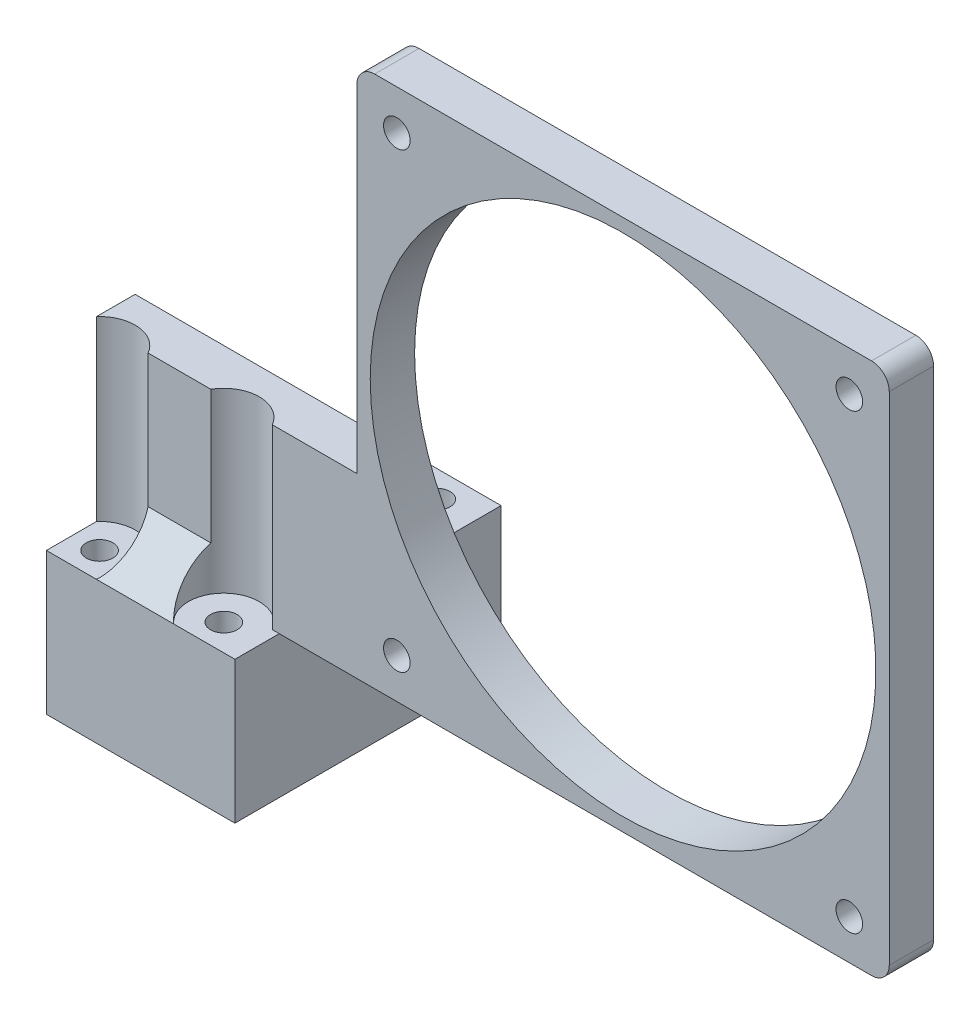
ISO-10303-21;
HEADER;
FILE_DESCRIPTION(('STEP AP214'),'2;1');
FILE_NAME('part.step','',(''),(''),'','','');
FILE_SCHEMA(('AUTOMOTIVE_DESIGN { 1 0 10303 214 1 1 1 1 }'));
ENDSEC;
DATA;
#1=APPLICATION_CONTEXT('core data for automotive mechanical design processes');
#2=APPLICATION_PROTOCOL_DEFINITION('international standard','automotive_design',2000,#1);
#3=PRODUCT_CONTEXT('',#1,'mechanical');
#4=PRODUCT('Part','Part','',(#3));
#5=PRODUCT_RELATED_PRODUCT_CATEGORY('part','',(#4));
#6=PRODUCT_DEFINITION_FORMATION('','',#4);
#7=PRODUCT_DEFINITION_CONTEXT('part definition',#1,'design');
#8=PRODUCT_DEFINITION('design','',#6,#7);
#9=PRODUCT_DEFINITION_SHAPE('','',#8);
#10=(LENGTH_UNIT() NAMED_UNIT(*) SI_UNIT(.MILLI.,.METRE.));
#11=(NAMED_UNIT(*) PLANE_ANGLE_UNIT() SI_UNIT($,.RADIAN.));
#12=(NAMED_UNIT(*) SI_UNIT($,.STERADIAN.) SOLID_ANGLE_UNIT());
#13=UNCERTAINTY_MEASURE_WITH_UNIT(LENGTH_MEASURE(1.E-05),#10,'distance_accuracy_value','');
#14=(GEOMETRIC_REPRESENTATION_CONTEXT(3) GLOBAL_UNCERTAINTY_ASSIGNED_CONTEXT((#13)) GLOBAL_UNIT_ASSIGNED_CONTEXT((#10,
#11,#12)) REPRESENTATION_CONTEXT('',''));
#15=CARTESIAN_POINT('',(0.,0.,0.));
#16=DIRECTION('',(0.,0.,1.));
#17=DIRECTION('',(1.,0.,0.));
#18=AXIS2_PLACEMENT_3D('',#15,#16,#17);
#19=CARTESIAN_POINT('',(0.,0.,0.));
#20=DIRECTION('',(0.,-1.,0.));
#21=DIRECTION('',(0.,0.,-1.));
#22=AXIS2_PLACEMENT_3D('',#19,#20,#21);
#23=PLANE('',#22);
#24=CARTESIAN_POINT('',(-73.,0.,7.));
#25=DIRECTION('',(0.,-1.,0.));
#26=DIRECTION('',(0.,0.,-1.));
#27=AXIS2_PLACEMENT_3D('',#24,#25,#26);
#28=CIRCLE('',#27,1.5);
#29=CARTESIAN_POINT('',(-73.,0.,5.5));
#30=VERTEX_POINT('',#29);
#31=EDGE_CURVE('E223',#30,#30,#28,.T.);
#32=ORIENTED_EDGE('',*,*,#31,.T.);
#33=EDGE_LOOP('',(#32));
#34=FACE_BOUND('',#33,.T.);
#35=CARTESIAN_POINT('',(-73.,0.,7.));
#36=DIRECTION('',(0.,1.,0.));
#37=DIRECTION('',(0.,0.,1.));
#38=AXIS2_PLACEMENT_3D('',#35,#36,#37);
#39=CIRCLE('',#38,4.00000000000001);
#40=CARTESIAN_POINT('',(-69.5358983848622,0.,5.));
#41=VERTEX_POINT('',#40);
#42=CARTESIAN_POINT('',(-75.6457513110646,0.,10.));
#43=VERTEX_POINT('',#42);
#44=EDGE_CURVE('E171',#41,#43,#39,.T.);
#45=ORIENTED_EDGE('',*,*,#44,.T.);
#46=DIRECTION('',(-1.,0.,0.));
#47=VECTOR('',#46,1.);
#48=CARTESIAN_POINT('',(-90.,0.,10.));
#49=LINE('',#48,#47);
#50=CARTESIAN_POINT('',(-68.75,0.,10.));
#51=VERTEX_POINT('',#50);
#52=EDGE_CURVE('E340',#51,#43,#49,.T.);
#53=ORIENTED_EDGE('',*,*,#52,.F.);
#54=DIRECTION('',(0.,0.,1.));
#55=VECTOR('',#54,1.);
#56=CARTESIAN_POINT('',(-68.75,0.,10.));
#57=LINE('',#56,#55);
#58=CARTESIAN_POINT('',(-68.75,0.,5.));
#59=VERTEX_POINT('',#58);
#60=EDGE_CURVE('E196',#59,#51,#57,.T.);
#61=ORIENTED_EDGE('',*,*,#60,.F.);
#62=DIRECTION('',(1.,0.,0.));
#63=VECTOR('',#62,1.);
#64=CARTESIAN_POINT('',(0.,0.,5.));
#65=LINE('',#64,#63);
#66=EDGE_CURVE('E188',#41,#59,#65,.T.);
#67=ORIENTED_EDGE('',*,*,#66,.F.);
#68=EDGE_LOOP('',(#45,#53,#61,#67));
#69=FACE_BOUND('',#68,.T.);
#70=ADVANCED_FACE('F38',(#34,#69),#23,.F.);
#71=CARTESIAN_POINT('',(0.,0.,5.));
#72=DIRECTION('',(0.,0.,1.));
#73=DIRECTION('',(1.,0.,0.));
#74=AXIS2_PLACEMENT_3D('',#71,#72,#73);
#75=PLANE('',#74);
#76=DIRECTION('',(0.,-1.,0.));
#77=VECTOR('',#76,1.);
#78=CARTESIAN_POINT('',(-83.5358983848622,30.,5.));
#79=LINE('',#78,#77);
#80=CARTESIAN_POINT('',(-83.5358983848622,20.,5.));
#81=VERTEX_POINT('',#80);
#82=CARTESIAN_POINT('',(-83.5358983848622,5.00000000000003,5.));
#83=VERTEX_POINT('',#82);
#84=EDGE_CURVE('E374',#81,#83,#79,.T.);
#85=ORIENTED_EDGE('',*,*,#84,.T.);
#86=DIRECTION('',(1.,0.,0.));
#87=VECTOR('',#86,1.);
#88=CARTESIAN_POINT('',(0.,5.00000000000003,5.));
#89=LINE('',#88,#87);
#90=CARTESIAN_POINT('',(-76.4641016151377,5.00000000000003,5.));
#91=VERTEX_POINT('',#90);
#92=EDGE_CURVE('E239',#83,#91,#89,.T.);
#93=ORIENTED_EDGE('',*,*,#92,.T.);
#94=DIRECTION('',(0.,-1.,0.));
#95=VECTOR('',#94,1.);
#96=CARTESIAN_POINT('',(-76.4641016151377,30.,5.));
#97=LINE('',#96,#95);
#98=CARTESIAN_POINT('',(-76.4641016151377,20.,5.));
#99=VERTEX_POINT('',#98);
#100=EDGE_CURVE('E192',#91,#99,#97,.F.);
#101=ORIENTED_EDGE('',*,*,#100,.T.);
#102=DIRECTION('',(1.,0.,0.));
#103=VECTOR('',#102,1.);
#104=CARTESIAN_POINT('',(-90.,20.,5.));
#105=LINE('',#104,#103);
#106=EDGE_CURVE('E315',#81,#99,#105,.T.);
#107=ORIENTED_EDGE('',*,*,#106,.F.);
#108=EDGE_LOOP('',(#85,#93,#101,#107));
#109=FACE_BOUND('',#108,.T.);
#110=ADVANCED_FACE('F435',(#109),#75,.T.);
#111=CARTESIAN_POINT('',(-30.,30.,5.));
#112=DIRECTION('',(0.,0.,-1.));
#113=DIRECTION('',(-1.,0.,0.));
#114=AXIS2_PLACEMENT_3D('',#111,#112,#113);
#115=CIRCLE('',#114,28.5);
#116=CARTESIAN_POINT('',(-58.5,30.,5.));
#117=VERTEX_POINT('',#116);
#118=EDGE_CURVE('E309',#117,#117,#115,.T.);
#119=ORIENTED_EDGE('',*,*,#118,.T.);
#120=EDGE_LOOP('',(#119));
#121=FACE_BOUND('',#120,.T.);
#122=CARTESIAN_POINT('',(-55.5,55.5,5.));
#123=DIRECTION('',(0.,0.,-1.));
#124=DIRECTION('',(-1.,0.,0.));
#125=AXIS2_PLACEMENT_3D('',#122,#123,#124);
#126=CIRCLE('',#125,1.5);
#127=CARTESIAN_POINT('',(-57.,55.5,5.));
#128=VERTEX_POINT('',#127);
#129=EDGE_CURVE('E291',#128,#128,#126,.T.);
#130=ORIENTED_EDGE('',*,*,#129,.T.);
#131=EDGE_LOOP('',(#130));
#132=FACE_BOUND('',#131,.T.);
#133=CARTESIAN_POINT('',(-4.5,4.50000000000002,5.));
#134=DIRECTION('',(0.,0.,-1.));
#135=DIRECTION('',(-1.,0.,0.));
#136=AXIS2_PLACEMENT_3D('',#133,#134,#135);
#137=CIRCLE('',#136,1.5);
#138=CARTESIAN_POINT('',(-6.,4.50000000000002,5.));
#139=VERTEX_POINT('',#138);
#140=EDGE_CURVE('E297',#139,#139,#137,.T.);
#141=ORIENTED_EDGE('',*,*,#140,.T.);
#142=EDGE_LOOP('',(#141));
#143=FACE_BOUND('',#142,.T.);
#144=CARTESIAN_POINT('',(-55.5,4.50000000000002,5.));
#145=DIRECTION('',(0.,0.,-1.));
#146=DIRECTION('',(-1.,0.,0.));
#147=AXIS2_PLACEMENT_3D('',#144,#145,#146);
#148=CIRCLE('',#147,1.5);
#149=CARTESIAN_POINT('',(-57.,4.50000000000002,5.));
#150=VERTEX_POINT('',#149);
#151=EDGE_CURVE('E298',#150,#150,#148,.T.);
#152=ORIENTED_EDGE('',*,*,#151,.T.);
#153=EDGE_LOOP('',(#152));
#154=FACE_BOUND('',#153,.T.);
#155=CARTESIAN_POINT('',(-4.5,55.5,5.));
#156=DIRECTION('',(0.,0.,-1.));
#157=DIRECTION('',(-1.,0.,0.));
#158=AXIS2_PLACEMENT_3D('',#155,#156,#157);
#159=CIRCLE('',#158,1.5);
#160=CARTESIAN_POINT('',(-6.,55.5,5.));
#161=VERTEX_POINT('',#160);
#162=EDGE_CURVE('E212',#161,#161,#159,.T.);
#163=ORIENTED_EDGE('',*,*,#162,.T.);
#164=EDGE_LOOP('',(#163));
#165=FACE_BOUND('',#164,.T.);
#166=CARTESIAN_POINT('',(-2.,0.,5.));
#167=VERTEX_POINT('',#166);
#168=EDGE_CURVE('E199',#59,#167,#65,.T.);
#169=ORIENTED_EDGE('',*,*,#168,.T.);
#170=CARTESIAN_POINT('',(-2.,2.,5.));
#171=DIRECTION('',(0.,0.,1.));
#172=DIRECTION('',(1.,0.,0.));
#173=AXIS2_PLACEMENT_3D('',#170,#171,#172);
#174=CIRCLE('',#173,2.);
#175=CARTESIAN_POINT('',(0.,2.,5.));
#176=VERTEX_POINT('',#175);
#177=EDGE_CURVE('E261',#167,#176,#174,.T.);
#178=ORIENTED_EDGE('',*,*,#177,.T.);
#179=DIRECTION('',(0.,1.,0.));
#180=VECTOR('',#179,1.);
#181=CARTESIAN_POINT('',(0.,0.,5.));
#182=LINE('',#181,#180);
#183=CARTESIAN_POINT('',(0.,58.,5.));
#184=VERTEX_POINT('',#183);
#185=EDGE_CURVE('E219',#176,#184,#182,.T.);
#186=ORIENTED_EDGE('',*,*,#185,.T.);
#187=CARTESIAN_POINT('',(-2.,58.,5.));
#188=DIRECTION('',(0.,0.,1.));
#189=DIRECTION('',(1.,0.,0.));
#190=AXIS2_PLACEMENT_3D('',#187,#188,#189);
#191=CIRCLE('',#190,2.);
#192=CARTESIAN_POINT('',(-2.,60.,5.));
#193=VERTEX_POINT('',#192);
#194=EDGE_CURVE('E258',#184,#193,#191,.T.);
#195=ORIENTED_EDGE('',*,*,#194,.T.);
#196=DIRECTION('',(-1.,0.,0.));
#197=VECTOR('',#196,1.);
#198=CARTESIAN_POINT('',(0.,60.,5.));
#199=LINE('',#198,#197);
#200=CARTESIAN_POINT('',(-58.,60.,5.));
#201=VERTEX_POINT('',#200);
#202=EDGE_CURVE('E269',#193,#201,#199,.T.);
#203=ORIENTED_EDGE('',*,*,#202,.T.);
#204=CARTESIAN_POINT('',(-58.,58.,5.));
#205=DIRECTION('',(0.,0.,1.));
#206=DIRECTION('',(1.,0.,0.));
#207=AXIS2_PLACEMENT_3D('',#204,#205,#206);
#208=CIRCLE('',#207,2.);
#209=CARTESIAN_POINT('',(-60.,58.,5.));
#210=VERTEX_POINT('',#209);
#211=EDGE_CURVE('E53',#201,#210,#208,.T.);
#212=ORIENTED_EDGE('',*,*,#211,.T.);
#213=DIRECTION('',(0.,-1.,0.));
#214=VECTOR('',#213,1.);
#215=CARTESIAN_POINT('',(-60.,0.,5.));
#216=LINE('',#215,#214);
#217=CARTESIAN_POINT('',(-60.,20.,5.));
#218=VERTEX_POINT('',#217);
#219=EDGE_CURVE('E204',#210,#218,#216,.T.);
#220=ORIENTED_EDGE('',*,*,#219,.T.);
#221=CARTESIAN_POINT('',(-69.5358983848622,20.,5.));
#222=VERTEX_POINT('',#221);
#223=EDGE_CURVE('E191',#222,#218,#105,.T.);
#224=ORIENTED_EDGE('',*,*,#223,.F.);
#225=DIRECTION('',(0.,-1.,0.));
#226=VECTOR('',#225,1.);
#227=CARTESIAN_POINT('',(-69.5358983848622,30.,5.));
#228=LINE('',#227,#226);
#229=EDGE_CURVE('E175',#222,#41,#228,.T.);
#230=ORIENTED_EDGE('',*,*,#229,.T.);
#231=ORIENTED_EDGE('',*,*,#66,.T.);
#232=EDGE_LOOP('',(#169,#178,#186,#195,#203,#212,#220,#224,#230,#231));
#233=FACE_BOUND('',#232,.T.);
#234=ADVANCED_FACE('F187',(#121,#132,#143,#154,#165,#233),#75,.T.);
#235=CARTESIAN_POINT('',(-90.,0.,0.));
#236=DIRECTION('',(1.,0.,0.));
#237=DIRECTION('',(0.,0.,-1.));
#238=AXIS2_PLACEMENT_3D('',#235,#236,#237);
#239=PLANE('',#238);
#240=DIRECTION('',(0.,-1.,0.));
#241=VECTOR('',#240,1.);
#242=CARTESIAN_POINT('',(-90.,30.,4.3542486889354));
#243=LINE('',#242,#241);
#244=CARTESIAN_POINT('',(-90.,20.,4.3542486889354));
#245=VERTEX_POINT('',#244);
#246=CARTESIAN_POINT('',(-90.,0.,4.3542486889354));
#247=VERTEX_POINT('',#246);
#248=EDGE_CURVE('E379',#245,#247,#243,.T.);
#249=ORIENTED_EDGE('',*,*,#248,.F.);
#250=DIRECTION('',(0.,0.,-1.));
#251=VECTOR('',#250,1.);
#252=CARTESIAN_POINT('',(-90.,20.,0.));
#253=LINE('',#252,#251);
#254=CARTESIAN_POINT('',(-90.,20.,0.));
#255=VERTEX_POINT('',#254);
#256=EDGE_CURVE('E321',#245,#255,#253,.T.);
#257=ORIENTED_EDGE('',*,*,#256,.T.);
#258=DIRECTION('',(0.,-1.,0.));
#259=VECTOR('',#258,1.);
#260=CARTESIAN_POINT('',(-90.,0.,0.));
#261=LINE('',#260,#259);
#262=CARTESIAN_POINT('',(-90.,9.99999999999994,0.));
#263=VERTEX_POINT('',#262);
#264=EDGE_CURVE('E323',#255,#263,#261,.T.);
#265=ORIENTED_EDGE('',*,*,#264,.T.);
#266=DIRECTION('',(0.,0.707106781186544,0.707106781186551));
#267=VECTOR('',#266,1.);
#268=CARTESIAN_POINT('',(-90.,5.00000000000002,-4.99999999999997));
#269=LINE('',#268,#267);
#270=CARTESIAN_POINT('',(-90.,0.,-10.));
#271=VERTEX_POINT('',#270);
#272=EDGE_CURVE('E237',#263,#271,#269,.F.);
#273=ORIENTED_EDGE('',*,*,#272,.T.);
#274=DIRECTION('',(0.,0.,-1.));
#275=VECTOR('',#274,1.);
#276=CARTESIAN_POINT('',(-90.,0.,10.));
#277=LINE('',#276,#275);
#278=CARTESIAN_POINT('',(-90.,0.,-20.));
#279=VERTEX_POINT('',#278);
#280=EDGE_CURVE('E350',#271,#279,#277,.T.);
#281=ORIENTED_EDGE('',*,*,#280,.T.);
#282=DIRECTION('',(0.,1.,0.));
#283=VECTOR('',#282,1.);
#284=CARTESIAN_POINT('',(-90.,-16.,-20.));
#285=LINE('',#284,#283);
#286=CARTESIAN_POINT('',(-90.,-16.,-20.));
#287=VERTEX_POINT('',#286);
#288=EDGE_CURVE('E324',#287,#279,#285,.T.);
#289=ORIENTED_EDGE('',*,*,#288,.F.);
#290=DIRECTION('',(0.,0.,-1.));
#291=VECTOR('',#290,1.);
#292=CARTESIAN_POINT('',(-90.,-16.,10.));
#293=LINE('',#292,#291);
#294=CARTESIAN_POINT('',(-90.,-16.,10.));
#295=VERTEX_POINT('',#294);
#296=EDGE_CURVE('E341',#295,#287,#293,.T.);
#297=ORIENTED_EDGE('',*,*,#296,.F.);
#298=DIRECTION('',(0.,1.,0.));
#299=VECTOR('',#298,1.);
#300=CARTESIAN_POINT('',(-90.,-16.,10.));
#301=LINE('',#300,#299);
#302=CARTESIAN_POINT('',(-90.,0.,10.));
#303=VERTEX_POINT('',#302);
#304=EDGE_CURVE('E336',#295,#303,#301,.T.);
#305=ORIENTED_EDGE('',*,*,#304,.T.);
#306=EDGE_CURVE('E348',#303,#247,#277,.T.);
#307=ORIENTED_EDGE('',*,*,#306,.T.);
#308=EDGE_LOOP('',(#249,#257,#265,#273,#281,#289,#297,#305,#307));
#309=FACE_BOUND('',#308,.T.);
#310=ADVANCED_FACE('F397',(#309),#239,.F.);
#311=CARTESIAN_POINT('',(0.,0.,5.));
#312=DIRECTION('',(0.,1.,0.));
#313=DIRECTION('',(0.,0.,1.));
#314=AXIS2_PLACEMENT_3D('',#311,#312,#313);
#315=PLANE('',#314);
#316=DIRECTION('',(1.,0.,0.));
#317=VECTOR('',#316,1.);
#318=CARTESIAN_POINT('',(0.,0.,0.));
#319=LINE('',#318,#317);
#320=CARTESIAN_POINT('',(-68.75,0.,0.));
#321=VERTEX_POINT('',#320);
#322=CARTESIAN_POINT('',(-2.,0.,0.));
#323=VERTEX_POINT('',#322);
#324=EDGE_CURVE('E216',#321,#323,#319,.T.);
#325=ORIENTED_EDGE('',*,*,#324,.T.);
#326=DIRECTION('',(0.,0.,-1.));
#327=VECTOR('',#326,1.);
#328=CARTESIAN_POINT('',(-2.,0.,5.));
#329=LINE('',#328,#327);
#330=EDGE_CURVE('E256',#323,#167,#329,.F.);
#331=ORIENTED_EDGE('',*,*,#330,.T.);
#332=ORIENTED_EDGE('',*,*,#168,.F.);
#333=EDGE_CURVE('E198',#321,#59,#57,.T.);
#334=ORIENTED_EDGE('',*,*,#333,.F.);
#335=EDGE_LOOP('',(#325,#331,#332,#334));
#336=FACE_BOUND('',#335,.T.);
#337=ADVANCED_FACE('F452',(#336),#315,.F.);
#338=CARTESIAN_POINT('',(-60.,0.,5.));
#339=DIRECTION('',(1.,0.,0.));
#340=DIRECTION('',(0.,0.,-1.));
#341=AXIS2_PLACEMENT_3D('',#338,#339,#340);
#342=PLANE('',#341);
#343=ORIENTED_EDGE('',*,*,#219,.F.);
#344=DIRECTION('',(0.,0.,-1.));
#345=VECTOR('',#344,1.);
#346=CARTESIAN_POINT('',(-60.,58.,5.));
#347=LINE('',#346,#345);
#348=CARTESIAN_POINT('',(-60.,58.,0.));
#349=VERTEX_POINT('',#348);
#350=EDGE_CURVE('E263',#210,#349,#347,.T.);
#351=ORIENTED_EDGE('',*,*,#350,.T.);
#352=DIRECTION('',(0.,-1.,0.));
#353=VECTOR('',#352,1.);
#354=CARTESIAN_POINT('',(-60.,0.,0.));
#355=LINE('',#354,#353);
#356=CARTESIAN_POINT('',(-60.,20.,0.));
#357=VERTEX_POINT('',#356);
#358=EDGE_CURVE('E214',#349,#357,#355,.T.);
#359=ORIENTED_EDGE('',*,*,#358,.T.);
#360=DIRECTION('',(0.,0.,-1.));
#361=VECTOR('',#360,1.);
#362=CARTESIAN_POINT('',(-60.,20.,0.));
#363=LINE('',#362,#361);
#364=EDGE_CURVE('E284',#218,#357,#363,.T.);
#365=ORIENTED_EDGE('',*,*,#364,.F.);
#366=EDGE_LOOP('',(#343,#351,#359,#365));
#367=FACE_BOUND('',#366,.T.);
#368=ADVANCED_FACE('F281',(#367),#342,.F.);
#369=CARTESIAN_POINT('',(0.,0.,5.));
#370=DIRECTION('',(-1.,0.,0.));
#371=DIRECTION('',(0.,-1.,0.));
#372=AXIS2_PLACEMENT_3D('',#369,#370,#371);
#373=PLANE('',#372);
#374=ORIENTED_EDGE('',*,*,#185,.F.);
#375=DIRECTION('',(0.,0.,-1.));
#376=VECTOR('',#375,1.);
#377=CARTESIAN_POINT('',(0.,2.,5.));
#378=LINE('',#377,#376);
#379=CARTESIAN_POINT('',(0.,2.,0.));
#380=VERTEX_POINT('',#379);
#381=EDGE_CURVE('E247',#176,#380,#378,.T.);
#382=ORIENTED_EDGE('',*,*,#381,.T.);
#383=DIRECTION('',(0.,1.,0.));
#384=VECTOR('',#383,1.);
#385=CARTESIAN_POINT('',(0.,0.,0.));
#386=LINE('',#385,#384);
#387=CARTESIAN_POINT('',(0.,58.,0.));
#388=VERTEX_POINT('',#387);
#389=EDGE_CURVE('E208',#380,#388,#386,.T.);
#390=ORIENTED_EDGE('',*,*,#389,.T.);
#391=DIRECTION('',(0.,0.,-1.));
#392=VECTOR('',#391,1.);
#393=CARTESIAN_POINT('',(0.,58.,5.));
#394=LINE('',#393,#392);
#395=EDGE_CURVE('E245',#388,#184,#394,.F.);
#396=ORIENTED_EDGE('',*,*,#395,.T.);
#397=EDGE_LOOP('',(#374,#382,#390,#396));
#398=FACE_BOUND('',#397,.T.);
#399=ADVANCED_FACE('F458',(#398),#373,.F.);
#400=CARTESIAN_POINT('',(0.,60.,5.));
#401=DIRECTION('',(0.,-1.,0.));
#402=DIRECTION('',(1.,0.,0.));
#403=AXIS2_PLACEMENT_3D('',#400,#401,#402);
#404=PLANE('',#403);
#405=DIRECTION('',(-1.,0.,0.));
#406=VECTOR('',#405,1.);
#407=CARTESIAN_POINT('',(0.,60.,0.));
#408=LINE('',#407,#406);
#409=CARTESIAN_POINT('',(-2.,60.,0.));
#410=VERTEX_POINT('',#409);
#411=CARTESIAN_POINT('',(-58.,60.,0.));
#412=VERTEX_POINT('',#411);
#413=EDGE_CURVE('E211',#410,#412,#408,.T.);
#414=ORIENTED_EDGE('',*,*,#413,.T.);
#415=DIRECTION('',(0.,0.,-1.));
#416=VECTOR('',#415,1.);
#417=CARTESIAN_POINT('',(-58.,60.,5.));
#418=LINE('',#417,#416);
#419=EDGE_CURVE('E11',#412,#201,#418,.F.);
#420=ORIENTED_EDGE('',*,*,#419,.T.);
#421=ORIENTED_EDGE('',*,*,#202,.F.);
#422=DIRECTION('',(0.,0.,-1.));
#423=VECTOR('',#422,1.);
#424=CARTESIAN_POINT('',(-2.,60.,5.));
#425=LINE('',#424,#423);
#426=EDGE_CURVE('E46',#193,#410,#425,.T.);
#427=ORIENTED_EDGE('',*,*,#426,.T.);
#428=EDGE_LOOP('',(#414,#420,#421,#427));
#429=FACE_BOUND('',#428,.T.);
#430=ADVANCED_FACE('F268',(#429),#404,.F.);
#431=CARTESIAN_POINT('',(0.,0.,0.));
#432=DIRECTION('',(0.,0.,1.));
#433=DIRECTION('',(1.,0.,0.));
#434=AXIS2_PLACEMENT_3D('',#431,#432,#433);
#435=PLANE('',#434);
#436=CARTESIAN_POINT('',(-30.,30.,0.));
#437=DIRECTION('',(0.,0.,-1.));
#438=DIRECTION('',(-1.,0.,0.));
#439=AXIS2_PLACEMENT_3D('',#436,#437,#438);
#440=CIRCLE('',#439,28.5);
#441=CARTESIAN_POINT('',(-58.5,30.,0.));
#442=VERTEX_POINT('',#441);
#443=EDGE_CURVE('E312',#442,#442,#440,.T.);
#444=ORIENTED_EDGE('',*,*,#443,.F.);
#445=EDGE_LOOP('',(#444));
#446=FACE_BOUND('',#445,.T.);
#447=CARTESIAN_POINT('',(-55.5,55.5,0.));
#448=DIRECTION('',(0.,0.,-1.));
#449=DIRECTION('',(-1.,0.,0.));
#450=AXIS2_PLACEMENT_3D('',#447,#448,#449);
#451=CIRCLE('',#450,1.5);
#452=CARTESIAN_POINT('',(-57.,55.5,0.));
#453=VERTEX_POINT('',#452);
#454=EDGE_CURVE('E301',#453,#453,#451,.T.);
#455=ORIENTED_EDGE('',*,*,#454,.F.);
#456=EDGE_LOOP('',(#455));
#457=FACE_BOUND('',#456,.T.);
#458=CARTESIAN_POINT('',(-4.5,4.50000000000002,0.));
#459=DIRECTION('',(0.,0.,-1.));
#460=DIRECTION('',(-1.,0.,0.));
#461=AXIS2_PLACEMENT_3D('',#458,#459,#460);
#462=CIRCLE('',#461,1.5);
#463=CARTESIAN_POINT('',(-6.,4.50000000000002,0.));
#464=VERTEX_POINT('',#463);
#465=EDGE_CURVE('E294',#464,#464,#462,.T.);
#466=ORIENTED_EDGE('',*,*,#465,.F.);
#467=EDGE_LOOP('',(#466));
#468=FACE_BOUND('',#467,.T.);
#469=CARTESIAN_POINT('',(-55.5,4.50000000000002,0.));
#470=DIRECTION('',(0.,0.,-1.));
#471=DIRECTION('',(-1.,0.,0.));
#472=AXIS2_PLACEMENT_3D('',#469,#470,#471);
#473=CIRCLE('',#472,1.5);
#474=CARTESIAN_POINT('',(-57.,4.50000000000002,0.));
#475=VERTEX_POINT('',#474);
#476=EDGE_CURVE('E306',#475,#475,#473,.T.);
#477=ORIENTED_EDGE('',*,*,#476,.F.);
#478=EDGE_LOOP('',(#477));
#479=FACE_BOUND('',#478,.T.);
#480=CARTESIAN_POINT('',(-4.5,55.5,0.));
#481=DIRECTION('',(0.,0.,-1.));
#482=DIRECTION('',(-1.,0.,0.));
#483=AXIS2_PLACEMENT_3D('',#480,#481,#482);
#484=CIRCLE('',#483,1.5);
#485=CARTESIAN_POINT('',(-6.,55.5,0.));
#486=VERTEX_POINT('',#485);
#487=EDGE_CURVE('E288',#486,#486,#484,.T.);
#488=ORIENTED_EDGE('',*,*,#487,.F.);
#489=EDGE_LOOP('',(#488));
#490=FACE_BOUND('',#489,.T.);
#491=ORIENTED_EDGE('',*,*,#389,.F.);
#492=CARTESIAN_POINT('',(-2.,2.,0.));
#493=DIRECTION('',(0.,0.,1.));
#494=DIRECTION('',(1.,0.,0.));
#495=AXIS2_PLACEMENT_3D('',#492,#493,#494);
#496=CIRCLE('',#495,2.);
#497=EDGE_CURVE('E254',#380,#323,#496,.F.);
#498=ORIENTED_EDGE('',*,*,#497,.T.);
#499=ORIENTED_EDGE('',*,*,#324,.F.);
#500=DIRECTION('',(0.,1.,0.));
#501=VECTOR('',#500,1.);
#502=CARTESIAN_POINT('',(-68.75,-16.,0.));
#503=LINE('',#502,#501);
#504=CARTESIAN_POINT('',(-68.75,9.99999999999994,0.));
#505=VERTEX_POINT('',#504);
#506=EDGE_CURVE('E232',#321,#505,#503,.T.);
#507=ORIENTED_EDGE('',*,*,#506,.T.);
#508=DIRECTION('',(-1.,0.,0.));
#509=VECTOR('',#508,1.);
#510=CARTESIAN_POINT('',(-90.,9.99999999999994,0.));
#511=LINE('',#510,#509);
#512=EDGE_CURVE('E230',#505,#263,#511,.T.);
#513=ORIENTED_EDGE('',*,*,#512,.T.);
#514=ORIENTED_EDGE('',*,*,#264,.F.);
#515=DIRECTION('',(1.,0.,0.));
#516=VECTOR('',#515,1.);
#517=CARTESIAN_POINT('',(-90.,20.,0.));
#518=LINE('',#517,#516);
#519=EDGE_CURVE('E319',#255,#357,#518,.T.);
#520=ORIENTED_EDGE('',*,*,#519,.T.);
#521=ORIENTED_EDGE('',*,*,#358,.F.);
#522=CARTESIAN_POINT('',(-58.,58.,0.));
#523=DIRECTION('',(0.,0.,1.));
#524=DIRECTION('',(1.,0.,0.));
#525=AXIS2_PLACEMENT_3D('',#522,#523,#524);
#526=CIRCLE('',#525,2.);
#527=EDGE_CURVE('E252',#349,#412,#526,.F.);
#528=ORIENTED_EDGE('',*,*,#527,.T.);
#529=ORIENTED_EDGE('',*,*,#413,.F.);
#530=CARTESIAN_POINT('',(-2.,58.,0.));
#531=DIRECTION('',(0.,0.,1.));
#532=DIRECTION('',(1.,0.,0.));
#533=AXIS2_PLACEMENT_3D('',#530,#531,#532);
#534=CIRCLE('',#533,2.);
#535=EDGE_CURVE('E250',#410,#388,#534,.F.);
#536=ORIENTED_EDGE('',*,*,#535,.T.);
#537=EDGE_LOOP('',(#491,#498,#499,#507,#513,#514,#520,#521,#528,#529,#536));
#538=FACE_BOUND('',#537,.T.);
#539=ADVANCED_FACE('F274',(#446,#457,#468,#479,#490,#538),#435,.F.);
#540=CARTESIAN_POINT('',(-4.5,55.5,5.));
#541=DIRECTION('',(0.,0.,-1.));
#542=DIRECTION('',(-1.,0.,0.));
#543=AXIS2_PLACEMENT_3D('',#540,#541,#542);
#544=CYLINDRICAL_SURFACE('',#543,1.5);
#545=ORIENTED_EDGE('',*,*,#162,.F.);
#546=EDGE_LOOP('',(#545));
#547=FACE_BOUND('',#546,.T.);
#548=ORIENTED_EDGE('',*,*,#487,.T.);
#549=EDGE_LOOP('',(#548));
#550=FACE_BOUND('',#549,.T.);
#551=ADVANCED_FACE('F447',(#547,#550),#544,.F.);
#552=CARTESIAN_POINT('',(-55.5,4.50000000000002,5.));
#553=DIRECTION('',(0.,0.,-1.));
#554=DIRECTION('',(-1.,0.,0.));
#555=AXIS2_PLACEMENT_3D('',#552,#553,#554);
#556=CYLINDRICAL_SURFACE('',#555,1.5);
#557=ORIENTED_EDGE('',*,*,#151,.F.);
#558=EDGE_LOOP('',(#557));
#559=FACE_BOUND('',#558,.T.);
#560=ORIENTED_EDGE('',*,*,#476,.T.);
#561=EDGE_LOOP('',(#560));
#562=FACE_BOUND('',#561,.T.);
#563=ADVANCED_FACE('F716',(#559,#562),#556,.F.);
#564=CARTESIAN_POINT('',(-4.5,4.50000000000002,5.));
#565=DIRECTION('',(0.,0.,-1.));
#566=DIRECTION('',(-1.,0.,0.));
#567=AXIS2_PLACEMENT_3D('',#564,#565,#566);
#568=CYLINDRICAL_SURFACE('',#567,1.5);
#569=ORIENTED_EDGE('',*,*,#140,.F.);
#570=EDGE_LOOP('',(#569));
#571=FACE_BOUND('',#570,.T.);
#572=ORIENTED_EDGE('',*,*,#465,.T.);
#573=EDGE_LOOP('',(#572));
#574=FACE_BOUND('',#573,.T.);
#575=ADVANCED_FACE('F706',(#571,#574),#568,.F.);
#576=CARTESIAN_POINT('',(-55.5,55.5,5.));
#577=DIRECTION('',(0.,0.,-1.));
#578=DIRECTION('',(-1.,0.,0.));
#579=AXIS2_PLACEMENT_3D('',#576,#577,#578);
#580=CYLINDRICAL_SURFACE('',#579,1.5);
#581=ORIENTED_EDGE('',*,*,#129,.F.);
#582=EDGE_LOOP('',(#581));
#583=FACE_BOUND('',#582,.T.);
#584=ORIENTED_EDGE('',*,*,#454,.T.);
#585=EDGE_LOOP('',(#584));
#586=FACE_BOUND('',#585,.T.);
#587=ADVANCED_FACE('F696',(#583,#586),#580,.F.);
#588=CARTESIAN_POINT('',(-30.,30.,5.));
#589=DIRECTION('',(0.,0.,-1.));
#590=DIRECTION('',(-1.,0.,0.));
#591=AXIS2_PLACEMENT_3D('',#588,#589,#590);
#592=CYLINDRICAL_SURFACE('',#591,28.5);
#593=ORIENTED_EDGE('',*,*,#118,.F.);
#594=EDGE_LOOP('',(#593));
#595=FACE_BOUND('',#594,.T.);
#596=ORIENTED_EDGE('',*,*,#443,.T.);
#597=EDGE_LOOP('',(#596));
#598=FACE_BOUND('',#597,.T.);
#599=ADVANCED_FACE('F639',(#595,#598),#592,.F.);
#600=CARTESIAN_POINT('',(-90.,20.,0.));
#601=DIRECTION('',(0.,-1.,0.));
#602=DIRECTION('',(0.,0.,-1.));
#603=AXIS2_PLACEMENT_3D('',#600,#601,#602);
#604=PLANE('',#603);
#605=CARTESIAN_POINT('',(-87.,20.,7.));
#606=DIRECTION('',(0.,-1.,0.));
#607=DIRECTION('',(0.,0.,-1.));
#608=AXIS2_PLACEMENT_3D('',#605,#606,#607);
#609=CIRCLE('',#608,4.00000000000001);
#610=EDGE_CURVE('E377',#81,#245,#609,.F.);
#611=ORIENTED_EDGE('',*,*,#610,.F.);
#612=ORIENTED_EDGE('',*,*,#106,.T.);
#613=CARTESIAN_POINT('',(-73.,20.,7.));
#614=DIRECTION('',(0.,-1.,0.));
#615=DIRECTION('',(0.,0.,-1.));
#616=AXIS2_PLACEMENT_3D('',#613,#614,#615);
#617=CIRCLE('',#616,4.00000000000001);
#618=EDGE_CURVE('E193',#222,#99,#617,.F.);
#619=ORIENTED_EDGE('',*,*,#618,.F.);
#620=ORIENTED_EDGE('',*,*,#223,.T.);
#621=ORIENTED_EDGE('',*,*,#364,.T.);
#622=ORIENTED_EDGE('',*,*,#519,.F.);
#623=ORIENTED_EDGE('',*,*,#256,.F.);
#624=EDGE_LOOP('',(#611,#612,#619,#620,#621,#622,#623));
#625=FACE_BOUND('',#624,.T.);
#626=ADVANCED_FACE('F400',(#625),#604,.F.);
#627=CARTESIAN_POINT('',(-87.,0.,-17.));
#628=DIRECTION('',(0.,-1.,0.));
#629=DIRECTION('',(0.,0.,-1.));
#630=AXIS2_PLACEMENT_3D('',#627,#628,#629);
#631=CIRCLE('',#630,1.5);
#632=CARTESIAN_POINT('',(-87.,0.,-18.5));
#633=VERTEX_POINT('',#632);
#634=EDGE_CURVE('E358',#633,#633,#631,.T.);
#635=ORIENTED_EDGE('',*,*,#634,.T.);
#636=EDGE_LOOP('',(#635));
#637=FACE_BOUND('',#636,.T.);
#638=CARTESIAN_POINT('',(-73.,0.,-17.));
#639=DIRECTION('',(0.,-1.,0.));
#640=DIRECTION('',(0.,0.,-1.));
#641=AXIS2_PLACEMENT_3D('',#638,#639,#640);
#642=CIRCLE('',#641,1.5);
#643=CARTESIAN_POINT('',(-73.,0.,-18.5));
#644=VERTEX_POINT('',#643);
#645=EDGE_CURVE('E227',#644,#644,#642,.T.);
#646=ORIENTED_EDGE('',*,*,#645,.T.);
#647=EDGE_LOOP('',(#646));
#648=FACE_BOUND('',#647,.T.);
#649=ORIENTED_EDGE('',*,*,#280,.F.);
#650=DIRECTION('',(1.,0.,0.));
#651=VECTOR('',#650,1.);
#652=CARTESIAN_POINT('',(-68.75,0.,-10.));
#653=LINE('',#652,#651);
#654=CARTESIAN_POINT('',(-68.75,0.,-10.));
#655=VERTEX_POINT('',#654);
#656=EDGE_CURVE('E201',#271,#655,#653,.T.);
#657=ORIENTED_EDGE('',*,*,#656,.T.);
#658=CARTESIAN_POINT('',(-68.75,0.,-20.));
#659=VERTEX_POINT('',#658);
#660=EDGE_CURVE('E203',#659,#655,#57,.T.);
#661=ORIENTED_EDGE('',*,*,#660,.F.);
#662=DIRECTION('',(1.,0.,0.));
#663=VECTOR('',#662,1.);
#664=CARTESIAN_POINT('',(-90.,0.,-20.));
#665=LINE('',#664,#663);
#666=EDGE_CURVE('E346',#279,#659,#665,.T.);
#667=ORIENTED_EDGE('',*,*,#666,.F.);
#668=EDGE_LOOP('',(#649,#657,#661,#667));
#669=FACE_BOUND('',#668,.T.);
#670=ADVANCED_FACE('F412',(#637,#648,#669),#23,.F.);
#671=CARTESIAN_POINT('',(-90.,-16.,-20.));
#672=DIRECTION('',(0.,0.,1.));
#673=DIRECTION('',(1.,0.,0.));
#674=AXIS2_PLACEMENT_3D('',#671,#672,#673);
#675=PLANE('',#674);
#676=ORIENTED_EDGE('',*,*,#666,.T.);
#677=DIRECTION('',(0.,1.,0.));
#678=VECTOR('',#677,1.);
#679=CARTESIAN_POINT('',(-68.75,-16.,-20.));
#680=LINE('',#679,#678);
#681=CARTESIAN_POINT('',(-68.75,-16.,-20.));
#682=VERTEX_POINT('',#681);
#683=EDGE_CURVE('E330',#682,#659,#680,.T.);
#684=ORIENTED_EDGE('',*,*,#683,.F.);
#685=DIRECTION('',(1.,0.,0.));
#686=VECTOR('',#685,1.);
#687=CARTESIAN_POINT('',(-90.,-16.,-20.));
#688=LINE('',#687,#686);
#689=EDGE_CURVE('E354',#287,#682,#688,.T.);
#690=ORIENTED_EDGE('',*,*,#689,.F.);
#691=ORIENTED_EDGE('',*,*,#288,.T.);
#692=EDGE_LOOP('',(#676,#684,#690,#691));
#693=FACE_BOUND('',#692,.T.);
#694=ADVANCED_FACE('F420',(#693),#675,.F.);
#695=CARTESIAN_POINT('',(-68.75,-16.,10.));
#696=DIRECTION('',(-1.,0.,0.));
#697=DIRECTION('',(0.,0.,1.));
#698=AXIS2_PLACEMENT_3D('',#695,#696,#697);
#699=PLANE('',#698);
#700=ORIENTED_EDGE('',*,*,#660,.T.);
#701=DIRECTION('',(0.,-0.707106781186544,-0.707106781186551));
#702=VECTOR('',#701,1.);
#703=CARTESIAN_POINT('',(-68.75,2.00000000000012,-7.99999999999992));
#704=LINE('',#703,#702);
#705=EDGE_CURVE('E235',#655,#505,#704,.F.);
#706=ORIENTED_EDGE('',*,*,#705,.T.);
#707=ORIENTED_EDGE('',*,*,#506,.F.);
#708=ORIENTED_EDGE('',*,*,#333,.T.);
#709=ORIENTED_EDGE('',*,*,#60,.T.);
#710=DIRECTION('',(0.,1.,0.));
#711=VECTOR('',#710,1.);
#712=CARTESIAN_POINT('',(-68.75,-16.,10.));
#713=LINE('',#712,#711);
#714=CARTESIAN_POINT('',(-68.75,-16.,10.));
#715=VERTEX_POINT('',#714);
#716=EDGE_CURVE('E333',#715,#51,#713,.T.);
#717=ORIENTED_EDGE('',*,*,#716,.F.);
#718=DIRECTION('',(0.,0.,1.));
#719=VECTOR('',#718,1.);
#720=CARTESIAN_POINT('',(-68.75,-16.,10.));
#721=LINE('',#720,#719);
#722=EDGE_CURVE('E352',#682,#715,#721,.T.);
#723=ORIENTED_EDGE('',*,*,#722,.F.);
#724=ORIENTED_EDGE('',*,*,#683,.T.);
#725=EDGE_LOOP('',(#700,#706,#707,#708,#709,#717,#723,#724));
#726=FACE_BOUND('',#725,.T.);
#727=ADVANCED_FACE('F415',(#726),#699,.F.);
#728=CARTESIAN_POINT('',(-90.,-16.,10.));
#729=DIRECTION('',(0.,0.,-1.));
#730=DIRECTION('',(-1.,0.,0.));
#731=AXIS2_PLACEMENT_3D('',#728,#729,#730);
#732=PLANE('',#731);
#733=ORIENTED_EDGE('',*,*,#52,.T.);
#734=CARTESIAN_POINT('',(-84.3542486889354,0.,10.));
#735=VERTEX_POINT('',#734);
#736=EDGE_CURVE('E342',#43,#735,#49,.T.);
#737=ORIENTED_EDGE('',*,*,#736,.T.);
#738=EDGE_CURVE('E343',#735,#303,#49,.T.);
#739=ORIENTED_EDGE('',*,*,#738,.T.);
#740=ORIENTED_EDGE('',*,*,#304,.F.);
#741=DIRECTION('',(-1.,0.,0.));
#742=VECTOR('',#741,1.);
#743=CARTESIAN_POINT('',(-90.,-16.,10.));
#744=LINE('',#743,#742);
#745=EDGE_CURVE('E339',#715,#295,#744,.T.);
#746=ORIENTED_EDGE('',*,*,#745,.F.);
#747=ORIENTED_EDGE('',*,*,#716,.T.);
#748=EDGE_LOOP('',(#733,#737,#739,#740,#746,#747));
#749=FACE_BOUND('',#748,.T.);
#750=ADVANCED_FACE('F428',(#749),#732,.F.);
#751=CARTESIAN_POINT('',(0.,-16.,0.));
#752=DIRECTION('',(0.,-1.,0.));
#753=DIRECTION('',(0.,0.,-1.));
#754=AXIS2_PLACEMENT_3D('',#751,#752,#753);
#755=PLANE('',#754);
#756=CARTESIAN_POINT('',(-73.,-16.,7.));
#757=DIRECTION('',(0.,-1.,0.));
#758=DIRECTION('',(0.,0.,-1.));
#759=AXIS2_PLACEMENT_3D('',#756,#757,#758);
#760=CIRCLE('',#759,1.5);
#761=CARTESIAN_POINT('',(-73.,-16.,5.5));
#762=VERTEX_POINT('',#761);
#763=EDGE_CURVE('E365',#762,#762,#760,.T.);
#764=ORIENTED_EDGE('',*,*,#763,.F.);
#765=EDGE_LOOP('',(#764));
#766=FACE_BOUND('',#765,.T.);
#767=CARTESIAN_POINT('',(-87.,-16.,-17.));
#768=DIRECTION('',(0.,-1.,0.));
#769=DIRECTION('',(0.,0.,-1.));
#770=AXIS2_PLACEMENT_3D('',#767,#768,#769);
#771=CIRCLE('',#770,1.5);
#772=CARTESIAN_POINT('',(-87.,-16.,-18.5));
#773=VERTEX_POINT('',#772);
#774=EDGE_CURVE('E366',#773,#773,#771,.T.);
#775=ORIENTED_EDGE('',*,*,#774,.F.);
#776=EDGE_LOOP('',(#775));
#777=FACE_BOUND('',#776,.T.);
#778=CARTESIAN_POINT('',(-73.,-16.,-17.));
#779=DIRECTION('',(0.,-1.,0.));
#780=DIRECTION('',(0.,0.,-1.));
#781=AXIS2_PLACEMENT_3D('',#778,#779,#780);
#782=CIRCLE('',#781,1.5);
#783=CARTESIAN_POINT('',(-73.,-16.,-18.5));
#784=VERTEX_POINT('',#783);
#785=EDGE_CURVE('E369',#784,#784,#782,.T.);
#786=ORIENTED_EDGE('',*,*,#785,.F.);
#787=EDGE_LOOP('',(#786));
#788=FACE_BOUND('',#787,.T.);
#789=CARTESIAN_POINT('',(-87.,-16.,7.));
#790=DIRECTION('',(0.,-1.,0.));
#791=DIRECTION('',(0.,0.,-1.));
#792=AXIS2_PLACEMENT_3D('',#789,#790,#791);
#793=CIRCLE('',#792,1.5);
#794=CARTESIAN_POINT('',(-87.,-16.,5.5));
#795=VERTEX_POINT('',#794);
#796=EDGE_CURVE('E224',#795,#795,#793,.T.);
#797=ORIENTED_EDGE('',*,*,#796,.F.);
#798=EDGE_LOOP('',(#797));
#799=FACE_BOUND('',#798,.T.);
#800=ORIENTED_EDGE('',*,*,#296,.T.);
#801=ORIENTED_EDGE('',*,*,#689,.T.);
#802=ORIENTED_EDGE('',*,*,#722,.T.);
#803=ORIENTED_EDGE('',*,*,#745,.T.);
#804=EDGE_LOOP('',(#800,#801,#802,#803));
#805=FACE_BOUND('',#804,.T.);
#806=ADVANCED_FACE('F425',(#766,#777,#788,#799,#805),#755,.T.);
#807=ORIENTED_EDGE('',*,*,#738,.F.);
#808=CARTESIAN_POINT('',(-87.,0.,7.));
#809=DIRECTION('',(0.,1.,0.));
#810=DIRECTION('',(0.,0.,1.));
#811=AXIS2_PLACEMENT_3D('',#808,#809,#810);
#812=CIRCLE('',#811,4.00000000000001);
#813=EDGE_CURVE('E183',#735,#247,#812,.T.);
#814=ORIENTED_EDGE('',*,*,#813,.T.);
#815=ORIENTED_EDGE('',*,*,#306,.F.);
#816=EDGE_LOOP('',(#807,#814,#815));
#817=FACE_BOUND('',#816,.T.);
#818=CARTESIAN_POINT('',(-87.,0.,7.));
#819=DIRECTION('',(0.,-1.,0.));
#820=DIRECTION('',(0.,0.,-1.));
#821=AXIS2_PLACEMENT_3D('',#818,#819,#820);
#822=CIRCLE('',#821,1.5);
#823=CARTESIAN_POINT('',(-87.,0.,5.5));
#824=VERTEX_POINT('',#823);
#825=EDGE_CURVE('E220',#824,#824,#822,.T.);
#826=ORIENTED_EDGE('',*,*,#825,.T.);
#827=EDGE_LOOP('',(#826));
#828=FACE_BOUND('',#827,.T.);
#829=ADVANCED_FACE('F388',(#817,#828),#23,.F.);
#830=CARTESIAN_POINT('',(-87.,14.,7.));
#831=DIRECTION('',(0.,-1.,0.));
#832=DIRECTION('',(0.,0.,-1.));
#833=AXIS2_PLACEMENT_3D('',#830,#831,#832);
#834=CYLINDRICAL_SURFACE('',#833,1.5);
#835=ORIENTED_EDGE('',*,*,#796,.T.);
#836=EDGE_LOOP('',(#835));
#837=FACE_BOUND('',#836,.T.);
#838=ORIENTED_EDGE('',*,*,#825,.F.);
#839=EDGE_LOOP('',(#838));
#840=FACE_BOUND('',#839,.T.);
#841=ADVANCED_FACE('F580',(#837,#840),#834,.F.);
#842=CARTESIAN_POINT('',(-73.,14.,7.));
#843=DIRECTION('',(0.,-1.,0.));
#844=DIRECTION('',(0.,0.,-1.));
#845=AXIS2_PLACEMENT_3D('',#842,#843,#844);
#846=CYLINDRICAL_SURFACE('',#845,1.5);
#847=ORIENTED_EDGE('',*,*,#763,.T.);
#848=EDGE_LOOP('',(#847));
#849=FACE_BOUND('',#848,.T.);
#850=ORIENTED_EDGE('',*,*,#31,.F.);
#851=EDGE_LOOP('',(#850));
#852=FACE_BOUND('',#851,.T.);
#853=ADVANCED_FACE('F658',(#849,#852),#846,.F.);
#854=CARTESIAN_POINT('',(-73.,14.,-17.));
#855=DIRECTION('',(0.,-1.,0.));
#856=DIRECTION('',(0.,0.,-1.));
#857=AXIS2_PLACEMENT_3D('',#854,#855,#856);
#858=CYLINDRICAL_SURFACE('',#857,1.5);
#859=ORIENTED_EDGE('',*,*,#785,.T.);
#860=EDGE_LOOP('',(#859));
#861=FACE_BOUND('',#860,.T.);
#862=ORIENTED_EDGE('',*,*,#645,.F.);
#863=EDGE_LOOP('',(#862));
#864=FACE_BOUND('',#863,.T.);
#865=ADVANCED_FACE('F648',(#861,#864),#858,.F.);
#866=CARTESIAN_POINT('',(-87.,14.,-17.));
#867=DIRECTION('',(0.,-1.,0.));
#868=DIRECTION('',(0.,0.,-1.));
#869=AXIS2_PLACEMENT_3D('',#866,#867,#868);
#870=CYLINDRICAL_SURFACE('',#869,1.5);
#871=ORIENTED_EDGE('',*,*,#774,.T.);
#872=EDGE_LOOP('',(#871));
#873=FACE_BOUND('',#872,.T.);
#874=ORIENTED_EDGE('',*,*,#634,.F.);
#875=EDGE_LOOP('',(#874));
#876=FACE_BOUND('',#875,.T.);
#877=ADVANCED_FACE('F570',(#873,#876),#870,.F.);
#878=CARTESIAN_POINT('',(-87.,30.,7.));
#879=DIRECTION('',(0.,-1.,0.));
#880=DIRECTION('',(0.,0.,-1.));
#881=AXIS2_PLACEMENT_3D('',#878,#879,#880);
#882=CYLINDRICAL_SURFACE('',#881,4.00000000000001);
#883=ORIENTED_EDGE('',*,*,#610,.T.);
#884=ORIENTED_EDGE('',*,*,#248,.T.);
#885=ORIENTED_EDGE('',*,*,#813,.F.);
#886=CARTESIAN_POINT('',(-87.,3.00000000000001,7.));
#887=DIRECTION('',(0.,-0.707106781186544,-0.707106781186551));
#888=DIRECTION('',(0.,-0.707106781186551,0.707106781186544));
#889=AXIS2_PLACEMENT_3D('',#886,#887,#888);
#890=ELLIPSE('',#889,5.65685424949242,4.00000000000001);
#891=EDGE_CURVE('E243',#735,#83,#890,.F.);
#892=ORIENTED_EDGE('',*,*,#891,.T.);
#893=ORIENTED_EDGE('',*,*,#84,.F.);
#894=EDGE_LOOP('',(#883,#884,#885,#892,#893));
#895=FACE_BOUND('',#894,.T.);
#896=ADVANCED_FACE('F393',(#895),#882,.F.);
#897=CARTESIAN_POINT('',(-73.,30.,7.));
#898=DIRECTION('',(0.,-1.,0.));
#899=DIRECTION('',(0.,0.,-1.));
#900=AXIS2_PLACEMENT_3D('',#897,#898,#899);
#901=CYLINDRICAL_SURFACE('',#900,4.00000000000001);
#902=ORIENTED_EDGE('',*,*,#44,.F.);
#903=ORIENTED_EDGE('',*,*,#229,.F.);
#904=ORIENTED_EDGE('',*,*,#618,.T.);
#905=ORIENTED_EDGE('',*,*,#100,.F.);
#906=CARTESIAN_POINT('',(-73.,3.00000000000001,7.));
#907=DIRECTION('',(0.,-0.707106781186544,-0.707106781186551));
#908=DIRECTION('',(0.,-0.707106781186551,0.707106781186544));
#909=AXIS2_PLACEMENT_3D('',#906,#907,#908);
#910=ELLIPSE('',#909,5.65685424949242,4.00000000000001);
#911=EDGE_CURVE('E178',#91,#43,#910,.F.);
#912=ORIENTED_EDGE('',*,*,#911,.T.);
#913=EDGE_LOOP('',(#902,#903,#904,#905,#912));
#914=FACE_BOUND('',#913,.T.);
#915=ADVANCED_FACE('F173',(#914),#901,.F.);
#916=CARTESIAN_POINT('',(0.,0.,-10.));
#917=DIRECTION('',(0.,0.707106781186551,-0.707106781186544));
#918=DIRECTION('',(-1.,0.,0.));
#919=AXIS2_PLACEMENT_3D('',#916,#917,#918);
#920=PLANE('',#919);
#921=ORIENTED_EDGE('',*,*,#272,.F.);
#922=ORIENTED_EDGE('',*,*,#512,.F.);
#923=ORIENTED_EDGE('',*,*,#705,.F.);
#924=ORIENTED_EDGE('',*,*,#656,.F.);
#925=EDGE_LOOP('',(#921,#922,#923,#924));
#926=FACE_BOUND('',#925,.T.);
#927=ADVANCED_FACE('F409',(#926),#920,.T.);
#928=CARTESIAN_POINT('',(0.,5.00000000000003,5.));
#929=DIRECTION('',(0.,-0.707106781186544,-0.707106781186551));
#930=DIRECTION('',(1.,0.,0.));
#931=AXIS2_PLACEMENT_3D('',#928,#929,#930);
#932=PLANE('',#931);
#933=ORIENTED_EDGE('',*,*,#891,.F.);
#934=ORIENTED_EDGE('',*,*,#736,.F.);
#935=ORIENTED_EDGE('',*,*,#911,.F.);
#936=ORIENTED_EDGE('',*,*,#92,.F.);
#937=EDGE_LOOP('',(#933,#934,#935,#936));
#938=FACE_BOUND('',#937,.T.);
#939=ADVANCED_FACE('F433',(#938),#932,.F.);
#940=CARTESIAN_POINT('',(-2.,2.,5.));
#941=DIRECTION('',(0.,0.,-1.));
#942=DIRECTION('',(-1.,0.,0.));
#943=AXIS2_PLACEMENT_3D('',#940,#941,#942);
#944=CYLINDRICAL_SURFACE('',#943,2.);
#945=ORIENTED_EDGE('',*,*,#177,.F.);
#946=ORIENTED_EDGE('',*,*,#330,.F.);
#947=ORIENTED_EDGE('',*,*,#497,.F.);
#948=ORIENTED_EDGE('',*,*,#381,.F.);
#949=EDGE_LOOP('',(#945,#946,#947,#948));
#950=FACE_BOUND('',#949,.T.);
#951=ADVANCED_FACE('F474',(#950),#944,.T.);
#952=CARTESIAN_POINT('',(-58.,58.,5.));
#953=DIRECTION('',(0.,0.,-1.));
#954=DIRECTION('',(-1.,0.,0.));
#955=AXIS2_PLACEMENT_3D('',#952,#953,#954);
#956=CYLINDRICAL_SURFACE('',#955,2.);
#957=ORIENTED_EDGE('',*,*,#211,.F.);
#958=ORIENTED_EDGE('',*,*,#419,.F.);
#959=ORIENTED_EDGE('',*,*,#527,.F.);
#960=ORIENTED_EDGE('',*,*,#350,.F.);
#961=EDGE_LOOP('',(#957,#958,#959,#960));
#962=FACE_BOUND('',#961,.T.);
#963=ADVANCED_FACE('F279',(#962),#956,.T.);
#964=CARTESIAN_POINT('',(-2.,58.,5.));
#965=DIRECTION('',(0.,0.,-1.));
#966=DIRECTION('',(-1.,0.,0.));
#967=AXIS2_PLACEMENT_3D('',#964,#965,#966);
#968=CYLINDRICAL_SURFACE('',#967,2.);
#969=ORIENTED_EDGE('',*,*,#194,.F.);
#970=ORIENTED_EDGE('',*,*,#395,.F.);
#971=ORIENTED_EDGE('',*,*,#535,.F.);
#972=ORIENTED_EDGE('',*,*,#426,.F.);
#973=EDGE_LOOP('',(#969,#970,#971,#972));
#974=FACE_BOUND('',#973,.T.);
#975=ADVANCED_FACE('F40',(#974),#968,.T.);
#976=CLOSED_SHELL('',(#70,#110,#234,#310,#337,#368,#399,#430,#539,#551,#563,#575,#587,#599,#626,
#670,#694,#727,#750,#806,#829,#841,#853,#865,#877,#896,#915,#927,#939,#951,#963,#975));
#977=MANIFOLD_SOLID_BREP('B2',#976);
#978=ADVANCED_BREP_SHAPE_REPRESENTATION('',(#18,#977),#14);
#979=SHAPE_DEFINITION_REPRESENTATION(#9,#978);
ENDSEC;
END-ISO-10303-21;
